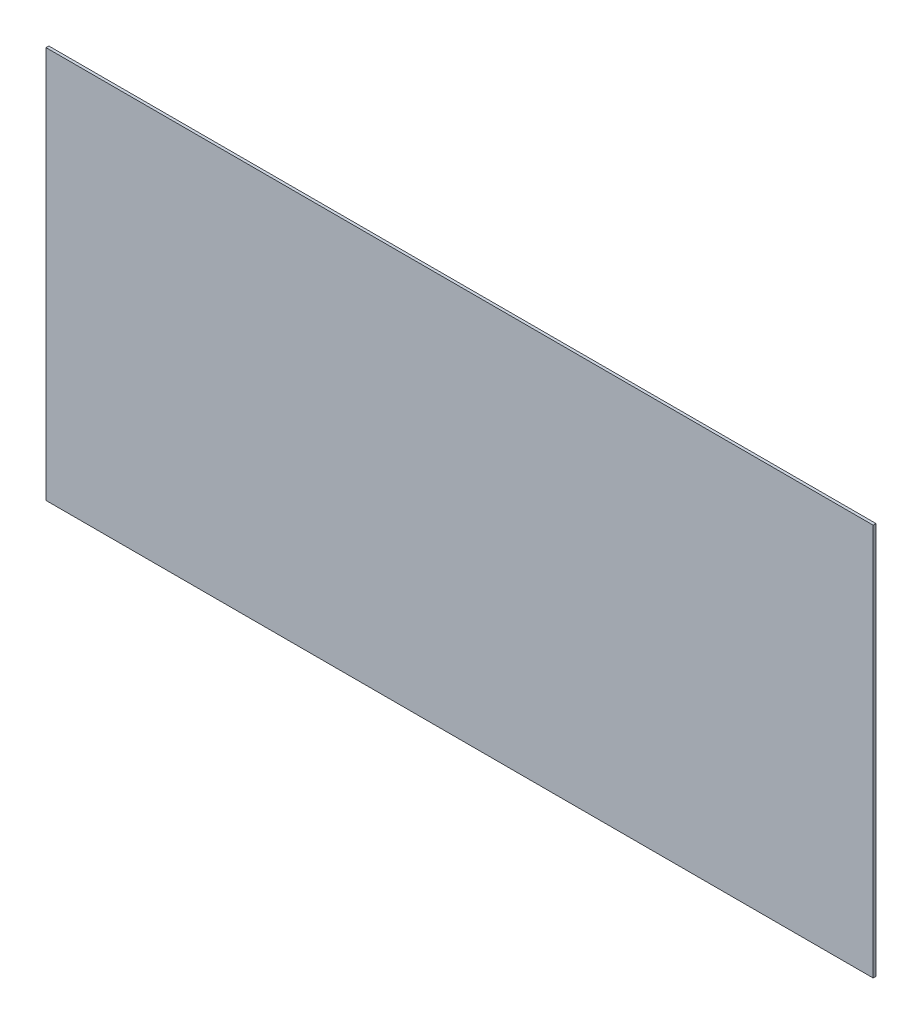
ISO-10303-21;
HEADER;
FILE_DESCRIPTION(('STEP AP214'),'2;1');
FILE_NAME('part.step','',(''),(''),'','','');
FILE_SCHEMA(('AUTOMOTIVE_DESIGN { 1 0 10303 214 1 1 1 1 }'));
ENDSEC;
DATA;
#1=APPLICATION_CONTEXT('core data for automotive mechanical design processes');
#2=APPLICATION_PROTOCOL_DEFINITION('international standard','automotive_design',2000,#1);
#3=PRODUCT_CONTEXT('',#1,'mechanical');
#4=PRODUCT('Part','Part','',(#3));
#5=PRODUCT_RELATED_PRODUCT_CATEGORY('part','',(#4));
#6=PRODUCT_DEFINITION_FORMATION('','',#4);
#7=PRODUCT_DEFINITION_CONTEXT('part definition',#1,'design');
#8=PRODUCT_DEFINITION('design','',#6,#7);
#9=PRODUCT_DEFINITION_SHAPE('','',#8);
#10=(LENGTH_UNIT() NAMED_UNIT(*) SI_UNIT(.MILLI.,.METRE.));
#11=(NAMED_UNIT(*) PLANE_ANGLE_UNIT() SI_UNIT($,.RADIAN.));
#12=(NAMED_UNIT(*) SI_UNIT($,.STERADIAN.) SOLID_ANGLE_UNIT());
#13=UNCERTAINTY_MEASURE_WITH_UNIT(LENGTH_MEASURE(1.E-05),#10,'distance_accuracy_value','');
#14=(GEOMETRIC_REPRESENTATION_CONTEXT(3) GLOBAL_UNCERTAINTY_ASSIGNED_CONTEXT((#13)) GLOBAL_UNIT_ASSIGNED_CONTEXT((#10,
#11,#12)) REPRESENTATION_CONTEXT('',''));
#15=CARTESIAN_POINT('',(0.,0.,0.));
#16=DIRECTION('',(0.,0.,1.));
#17=DIRECTION('',(1.,0.,0.));
#18=AXIS2_PLACEMENT_3D('',#15,#16,#17);
#19=CARTESIAN_POINT('',(20.965,0.,25.));
#20=DIRECTION('',(0.,0.,1.));
#21=DIRECTION('',(1.,0.,0.));
#22=AXIS2_PLACEMENT_3D('',#19,#20,#21);
#23=PLANE('',#22);
#24=DIRECTION('',(0.,1.,0.));
#25=VECTOR('',#24,1.);
#26=CARTESIAN_POINT('',(-29.27,17.385,25.));
#27=LINE('',#26,#25);
#28=CARTESIAN_POINT('',(-29.27,17.385,25.));
#29=VERTEX_POINT('',#28);
#30=CARTESIAN_POINT('',(-29.27,-10.385,25.));
#31=VERTEX_POINT('',#30);
#32=EDGE_CURVE('E79',#29,#31,#27,.F.);
#33=ORIENTED_EDGE('',*,*,#32,.F.);
#34=DIRECTION('',(1.,0.,0.));
#35=VECTOR('',#34,1.);
#36=CARTESIAN_POINT('',(29.29,17.385,25.));
#37=LINE('',#36,#35);
#38=CARTESIAN_POINT('',(29.29,17.385,25.));
#39=VERTEX_POINT('',#38);
#40=EDGE_CURVE('E55',#39,#29,#37,.F.);
#41=ORIENTED_EDGE('',*,*,#40,.F.);
#42=DIRECTION('',(0.,1.,0.));
#43=VECTOR('',#42,1.);
#44=CARTESIAN_POINT('',(29.29,-10.385,25.));
#45=LINE('',#44,#43);
#46=CARTESIAN_POINT('',(29.29,-10.385,25.));
#47=VERTEX_POINT('',#46);
#48=EDGE_CURVE('E57',#47,#39,#45,.T.);
#49=ORIENTED_EDGE('',*,*,#48,.F.);
#50=DIRECTION('',(1.,0.,0.));
#51=VECTOR('',#50,1.);
#52=CARTESIAN_POINT('',(-29.27,-10.385,25.));
#53=LINE('',#52,#51);
#54=EDGE_CURVE('E20',#31,#47,#53,.T.);
#55=ORIENTED_EDGE('',*,*,#54,.F.);
#56=EDGE_LOOP('',(#33,#41,#49,#55));
#57=FACE_BOUND('',#56,.T.);
#58=ADVANCED_FACE('F17',(#57),#23,.F.);
#59=CARTESIAN_POINT('',(-29.27,-10.385,25.));
#60=DIRECTION('',(0.,-1.,0.));
#61=DIRECTION('',(0.,0.,-1.));
#62=AXIS2_PLACEMENT_3D('',#59,#60,#61);
#63=PLANE('',#62);
#64=DIRECTION('',(1.,0.,0.));
#65=VECTOR('',#64,1.);
#66=CARTESIAN_POINT('',(20.965,-10.385,25.2));
#67=LINE('',#66,#65);
#68=CARTESIAN_POINT('',(-29.27,-10.385,25.2));
#69=VERTEX_POINT('',#68);
#70=CARTESIAN_POINT('',(29.29,-10.385,25.2));
#71=VERTEX_POINT('',#70);
#72=EDGE_CURVE('E83',#69,#71,#67,.T.);
#73=ORIENTED_EDGE('',*,*,#72,.F.);
#74=DIRECTION('',(0.,0.,1.));
#75=VECTOR('',#74,1.);
#76=CARTESIAN_POINT('',(-29.27,-10.385,25.));
#77=LINE('',#76,#75);
#78=EDGE_CURVE('E68',#31,#69,#77,.T.);
#79=ORIENTED_EDGE('',*,*,#78,.F.);
#80=ORIENTED_EDGE('',*,*,#54,.T.);
#81=DIRECTION('',(0.,0.,-1.));
#82=VECTOR('',#81,1.);
#83=CARTESIAN_POINT('',(29.29,-10.385,25.));
#84=LINE('',#83,#82);
#85=EDGE_CURVE('E63',#71,#47,#84,.T.);
#86=ORIENTED_EDGE('',*,*,#85,.F.);
#87=EDGE_LOOP('',(#73,#79,#80,#86));
#88=FACE_BOUND('',#87,.T.);
#89=ADVANCED_FACE('F65',(#88),#63,.T.);
#90=CARTESIAN_POINT('',(29.29,-10.385,25.));
#91=DIRECTION('',(1.,0.,0.));
#92=DIRECTION('',(0.,0.,-1.));
#93=AXIS2_PLACEMENT_3D('',#90,#91,#92);
#94=PLANE('',#93);
#95=DIRECTION('',(0.,1.,0.));
#96=VECTOR('',#95,1.);
#97=CARTESIAN_POINT('',(29.29,0.,25.2));
#98=LINE('',#97,#96);
#99=CARTESIAN_POINT('',(29.29,17.385,25.2));
#100=VERTEX_POINT('',#99);
#101=EDGE_CURVE('E72',#71,#100,#98,.T.);
#102=ORIENTED_EDGE('',*,*,#101,.F.);
#103=ORIENTED_EDGE('',*,*,#85,.T.);
#104=ORIENTED_EDGE('',*,*,#48,.T.);
#105=DIRECTION('',(0.,0.,1.));
#106=VECTOR('',#105,1.);
#107=CARTESIAN_POINT('',(29.29,17.385,25.));
#108=LINE('',#107,#106);
#109=EDGE_CURVE('E75',#100,#39,#108,.F.);
#110=ORIENTED_EDGE('',*,*,#109,.F.);
#111=EDGE_LOOP('',(#102,#103,#104,#110));
#112=FACE_BOUND('',#111,.T.);
#113=ADVANCED_FACE('F70',(#112),#94,.T.);
#114=CARTESIAN_POINT('',(29.29,17.385,25.));
#115=DIRECTION('',(0.,1.,0.));
#116=DIRECTION('',(0.,0.,1.));
#117=AXIS2_PLACEMENT_3D('',#114,#115,#116);
#118=PLANE('',#117);
#119=DIRECTION('',(1.,0.,0.));
#120=VECTOR('',#119,1.);
#121=CARTESIAN_POINT('',(20.965,17.385,25.2));
#122=LINE('',#121,#120);
#123=CARTESIAN_POINT('',(-29.27,17.385,25.2));
#124=VERTEX_POINT('',#123);
#125=EDGE_CURVE('E26',#100,#124,#122,.F.);
#126=ORIENTED_EDGE('',*,*,#125,.F.);
#127=ORIENTED_EDGE('',*,*,#109,.T.);
#128=ORIENTED_EDGE('',*,*,#40,.T.);
#129=DIRECTION('',(0.,0.,1.));
#130=VECTOR('',#129,1.);
#131=CARTESIAN_POINT('',(-29.27,17.385,25.));
#132=LINE('',#131,#130);
#133=EDGE_CURVE('E35',#124,#29,#132,.F.);
#134=ORIENTED_EDGE('',*,*,#133,.F.);
#135=EDGE_LOOP('',(#126,#127,#128,#134));
#136=FACE_BOUND('',#135,.T.);
#137=ADVANCED_FACE('F89',(#136),#118,.T.);
#138=CARTESIAN_POINT('',(-29.27,17.385,25.));
#139=DIRECTION('',(-1.,0.,0.));
#140=DIRECTION('',(0.,0.,1.));
#141=AXIS2_PLACEMENT_3D('',#138,#139,#140);
#142=PLANE('',#141);
#143=DIRECTION('',(0.,1.,0.));
#144=VECTOR('',#143,1.);
#145=CARTESIAN_POINT('',(-29.27,0.,25.2));
#146=LINE('',#145,#144);
#147=EDGE_CURVE('E11',#124,#69,#146,.F.);
#148=ORIENTED_EDGE('',*,*,#147,.F.);
#149=ORIENTED_EDGE('',*,*,#133,.T.);
#150=ORIENTED_EDGE('',*,*,#32,.T.);
#151=ORIENTED_EDGE('',*,*,#78,.T.);
#152=EDGE_LOOP('',(#148,#149,#150,#151));
#153=FACE_BOUND('',#152,.T.);
#154=ADVANCED_FACE('F91',(#153),#142,.T.);
#155=CARTESIAN_POINT('',(20.965,0.,25.2));
#156=DIRECTION('',(0.,0.,1.));
#157=DIRECTION('',(1.,0.,0.));
#158=AXIS2_PLACEMENT_3D('',#155,#156,#157);
#159=PLANE('',#158);
#160=ORIENTED_EDGE('',*,*,#125,.T.);
#161=ORIENTED_EDGE('',*,*,#147,.T.);
#162=ORIENTED_EDGE('',*,*,#72,.T.);
#163=ORIENTED_EDGE('',*,*,#101,.T.);
#164=EDGE_LOOP('',(#160,#161,#162,#163));
#165=FACE_BOUND('',#164,.T.);
#166=ADVANCED_FACE('F88',(#165),#159,.T.);
#167=CLOSED_SHELL('',(#58,#89,#113,#137,#154,#166));
#168=MANIFOLD_SOLID_BREP('B1',#167);
#169=ADVANCED_BREP_SHAPE_REPRESENTATION('',(#18,#168),#14);
#170=SHAPE_DEFINITION_REPRESENTATION(#9,#169);
ENDSEC;
END-ISO-10303-21;
